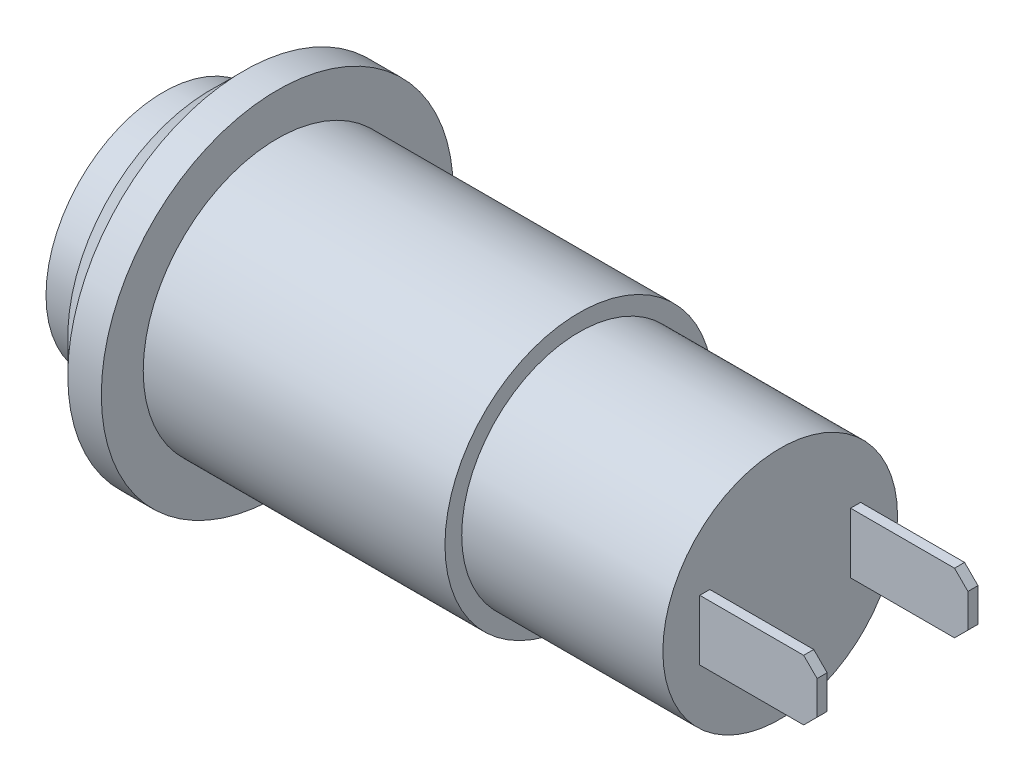
ISO-10303-21;
HEADER;
FILE_DESCRIPTION(('STEP AP214'),'2;1');
FILE_NAME('part.step','',(''),(''),'','','');
FILE_SCHEMA(('AUTOMOTIVE_DESIGN { 1 0 10303 214 1 1 1 1 }'));
ENDSEC;
DATA;
#1=APPLICATION_CONTEXT('core data for automotive mechanical design processes');
#2=APPLICATION_PROTOCOL_DEFINITION('international standard','automotive_design',2000,#1);
#3=PRODUCT_CONTEXT('',#1,'mechanical');
#4=PRODUCT('Part','Part','',(#3));
#5=PRODUCT_RELATED_PRODUCT_CATEGORY('part','',(#4));
#6=PRODUCT_DEFINITION_FORMATION('','',#4);
#7=PRODUCT_DEFINITION_CONTEXT('part definition',#1,'design');
#8=PRODUCT_DEFINITION('design','',#6,#7);
#9=PRODUCT_DEFINITION_SHAPE('','',#8);
#10=(LENGTH_UNIT() NAMED_UNIT(*) SI_UNIT(.MILLI.,.METRE.));
#11=(NAMED_UNIT(*) PLANE_ANGLE_UNIT() SI_UNIT($,.RADIAN.));
#12=(NAMED_UNIT(*) SI_UNIT($,.STERADIAN.) SOLID_ANGLE_UNIT());
#13=UNCERTAINTY_MEASURE_WITH_UNIT(LENGTH_MEASURE(1.E-05),#10,'distance_accuracy_value','');
#14=(GEOMETRIC_REPRESENTATION_CONTEXT(3) GLOBAL_UNCERTAINTY_ASSIGNED_CONTEXT((#13)) GLOBAL_UNIT_ASSIGNED_CONTEXT((#10,
#11,#12)) REPRESENTATION_CONTEXT('',''));
#15=CARTESIAN_POINT('',(0.,0.,0.));
#16=DIRECTION('',(0.,0.,1.));
#17=DIRECTION('',(1.,0.,0.));
#18=AXIS2_PLACEMENT_3D('',#15,#16,#17);
#19=CARTESIAN_POINT('',(18.4,0.,0.));
#20=DIRECTION('',(-1.,0.,0.));
#21=DIRECTION('',(0.,0.,1.));
#22=AXIS2_PLACEMENT_3D('',#19,#20,#21);
#23=PLANE('',#22);
#24=DIRECTION('',(0.,-1.,0.));
#25=VECTOR('',#24,1.);
#26=CARTESIAN_POINT('',(18.4,-0.9,2.4));
#27=LINE('',#26,#25);
#28=CARTESIAN_POINT('',(18.4,0.9,2.4));
#29=VERTEX_POINT('',#28);
#30=CARTESIAN_POINT('',(18.4,-0.9,2.4));
#31=VERTEX_POINT('',#30);
#32=EDGE_CURVE('E177',#29,#31,#27,.T.);
#33=ORIENTED_EDGE('',*,*,#32,.F.);
#34=DIRECTION('',(0.,0.,1.));
#35=VECTOR('',#34,1.);
#36=CARTESIAN_POINT('',(18.4,0.9,2.1));
#37=LINE('',#36,#35);
#38=CARTESIAN_POINT('',(18.4,0.9,2.1));
#39=VERTEX_POINT('',#38);
#40=EDGE_CURVE('E183',#39,#29,#37,.T.);
#41=ORIENTED_EDGE('',*,*,#40,.F.);
#42=DIRECTION('',(0.,1.,0.));
#43=VECTOR('',#42,1.);
#44=CARTESIAN_POINT('',(18.4,-0.9,2.1));
#45=LINE('',#44,#43);
#46=CARTESIAN_POINT('',(18.4,-0.9,2.1));
#47=VERTEX_POINT('',#46);
#48=EDGE_CURVE('E195',#47,#39,#45,.T.);
#49=ORIENTED_EDGE('',*,*,#48,.F.);
#50=DIRECTION('',(0.,0.,-1.));
#51=VECTOR('',#50,1.);
#52=CARTESIAN_POINT('',(18.4,-0.9,2.1));
#53=LINE('',#52,#51);
#54=EDGE_CURVE('E191',#31,#47,#53,.T.);
#55=ORIENTED_EDGE('',*,*,#54,.F.);
#56=EDGE_LOOP('',(#33,#41,#49,#55));
#57=FACE_BOUND('',#56,.T.);
#58=CARTESIAN_POINT('',(18.4,0.,0.));
#59=DIRECTION('',(-1.,0.,0.));
#60=DIRECTION('',(0.,0.,1.));
#61=AXIS2_PLACEMENT_3D('',#58,#59,#60);
#62=CIRCLE('',#61,3.5);
#63=CARTESIAN_POINT('',(18.4,0.,3.5));
#64=VERTEX_POINT('',#63);
#65=EDGE_CURVE('E237',#64,#64,#62,.T.);
#66=ORIENTED_EDGE('',*,*,#65,.F.);
#67=EDGE_LOOP('',(#66));
#68=FACE_BOUND('',#67,.T.);
#69=DIRECTION('',(0.,1.,0.));
#70=VECTOR('',#69,1.);
#71=CARTESIAN_POINT('',(18.4,-0.9,-2.4));
#72=LINE('',#71,#70);
#73=CARTESIAN_POINT('',(18.4,-0.9,-2.4));
#74=VERTEX_POINT('',#73);
#75=CARTESIAN_POINT('',(18.4,0.9,-2.4));
#76=VERTEX_POINT('',#75);
#77=EDGE_CURVE('E140',#74,#76,#72,.T.);
#78=ORIENTED_EDGE('',*,*,#77,.F.);
#79=DIRECTION('',(0.,0.,-1.));
#80=VECTOR('',#79,1.);
#81=CARTESIAN_POINT('',(18.4,-0.9,-2.1));
#82=LINE('',#81,#80);
#83=CARTESIAN_POINT('',(18.4,-0.9,-2.1));
#84=VERTEX_POINT('',#83);
#85=EDGE_CURVE('E151',#84,#74,#82,.T.);
#86=ORIENTED_EDGE('',*,*,#85,.F.);
#87=DIRECTION('',(0.,-1.,0.));
#88=VECTOR('',#87,1.);
#89=CARTESIAN_POINT('',(18.4,-0.9,-2.1));
#90=LINE('',#89,#88);
#91=CARTESIAN_POINT('',(18.4,0.9,-2.1));
#92=VERTEX_POINT('',#91);
#93=EDGE_CURVE('E160',#92,#84,#90,.T.);
#94=ORIENTED_EDGE('',*,*,#93,.F.);
#95=DIRECTION('',(0.,0.,1.));
#96=VECTOR('',#95,1.);
#97=CARTESIAN_POINT('',(18.4,0.9,-2.1));
#98=LINE('',#97,#96);
#99=EDGE_CURVE('E154',#76,#92,#98,.T.);
#100=ORIENTED_EDGE('',*,*,#99,.F.);
#101=EDGE_LOOP('',(#78,#86,#94,#100));
#102=FACE_BOUND('',#101,.T.);
#103=ADVANCED_FACE('F45',(#57,#68,#102),#23,.F.);
#104=CARTESIAN_POINT('',(0.,0.,0.));
#105=DIRECTION('',(-1.,0.,0.));
#106=DIRECTION('',(0.,0.,1.));
#107=AXIS2_PLACEMENT_3D('',#104,#105,#106);
#108=CYLINDRICAL_SURFACE('',#107,3.5);
#109=CARTESIAN_POINT('',(12.4,0.,0.));
#110=DIRECTION('',(-1.,0.,0.));
#111=DIRECTION('',(0.,0.,1.));
#112=AXIS2_PLACEMENT_3D('',#109,#110,#111);
#113=CIRCLE('',#112,3.5);
#114=CARTESIAN_POINT('',(12.4,0.,3.5));
#115=VERTEX_POINT('',#114);
#116=EDGE_CURVE('E233',#115,#115,#113,.T.);
#117=ORIENTED_EDGE('',*,*,#116,.F.);
#118=EDGE_LOOP('',(#117));
#119=FACE_BOUND('',#118,.T.);
#120=ORIENTED_EDGE('',*,*,#65,.T.);
#121=EDGE_LOOP('',(#120));
#122=FACE_BOUND('',#121,.T.);
#123=ADVANCED_FACE('F325',(#119,#122),#108,.T.);
#124=CARTESIAN_POINT('',(12.4,3.5,0.));
#125=DIRECTION('',(-1.,0.,0.));
#126=DIRECTION('',(0.,0.,1.));
#127=AXIS2_PLACEMENT_3D('',#124,#125,#126);
#128=PLANE('',#127);
#129=CARTESIAN_POINT('',(12.4,0.,0.));
#130=DIRECTION('',(-1.,0.,0.));
#131=DIRECTION('',(0.,0.,1.));
#132=AXIS2_PLACEMENT_3D('',#129,#130,#131);
#133=CIRCLE('',#132,4.);
#134=CARTESIAN_POINT('',(12.4,0.,4.));
#135=VERTEX_POINT('',#134);
#136=EDGE_CURVE('E229',#135,#135,#133,.T.);
#137=ORIENTED_EDGE('',*,*,#136,.F.);
#138=EDGE_LOOP('',(#137));
#139=FACE_BOUND('',#138,.T.);
#140=ORIENTED_EDGE('',*,*,#116,.T.);
#141=EDGE_LOOP('',(#140));
#142=FACE_BOUND('',#141,.T.);
#143=ADVANCED_FACE('F330',(#139,#142),#128,.F.);
#144=CARTESIAN_POINT('',(0.,0.,0.));
#145=DIRECTION('',(-1.,0.,0.));
#146=DIRECTION('',(0.,0.,1.));
#147=AXIS2_PLACEMENT_3D('',#144,#145,#146);
#148=CYLINDRICAL_SURFACE('',#147,4.);
#149=CARTESIAN_POINT('',(3.4,0.,0.));
#150=DIRECTION('',(-1.,0.,0.));
#151=DIRECTION('',(0.,0.,1.));
#152=AXIS2_PLACEMENT_3D('',#149,#150,#151);
#153=CIRCLE('',#152,4.);
#154=CARTESIAN_POINT('',(3.4,0.,4.));
#155=VERTEX_POINT('',#154);
#156=EDGE_CURVE('E225',#155,#155,#153,.T.);
#157=ORIENTED_EDGE('',*,*,#156,.F.);
#158=EDGE_LOOP('',(#157));
#159=FACE_BOUND('',#158,.T.);
#160=ORIENTED_EDGE('',*,*,#136,.T.);
#161=EDGE_LOOP('',(#160));
#162=FACE_BOUND('',#161,.T.);
#163=ADVANCED_FACE('F336',(#159,#162),#148,.T.);
#164=CARTESIAN_POINT('',(3.4,4.,0.));
#165=DIRECTION('',(-1.,0.,0.));
#166=DIRECTION('',(0.,0.,1.));
#167=AXIS2_PLACEMENT_3D('',#164,#165,#166);
#168=PLANE('',#167);
#169=CARTESIAN_POINT('',(3.4,0.,0.));
#170=DIRECTION('',(-1.,0.,0.));
#171=DIRECTION('',(0.,0.,1.));
#172=AXIS2_PLACEMENT_3D('',#169,#170,#171);
#173=CIRCLE('',#172,5.25);
#174=CARTESIAN_POINT('',(3.4,0.,5.25));
#175=VERTEX_POINT('',#174);
#176=EDGE_CURVE('E221',#175,#175,#173,.T.);
#177=ORIENTED_EDGE('',*,*,#176,.F.);
#178=EDGE_LOOP('',(#177));
#179=FACE_BOUND('',#178,.T.);
#180=ORIENTED_EDGE('',*,*,#156,.T.);
#181=EDGE_LOOP('',(#180));
#182=FACE_BOUND('',#181,.T.);
#183=ADVANCED_FACE('F419',(#179,#182),#168,.F.);
#184=CARTESIAN_POINT('',(0.,0.,0.));
#185=DIRECTION('',(-1.,0.,0.));
#186=DIRECTION('',(0.,0.,1.));
#187=AXIS2_PLACEMENT_3D('',#184,#185,#186);
#188=CYLINDRICAL_SURFACE('',#187,5.25);
#189=CARTESIAN_POINT('',(2.4,0.,0.));
#190=DIRECTION('',(1.,0.,0.));
#191=DIRECTION('',(0.,0.,-1.));
#192=AXIS2_PLACEMENT_3D('',#189,#190,#191);
#193=CIRCLE('',#192,5.25);
#194=CARTESIAN_POINT('',(2.4,0.,-5.25));
#195=VERTEX_POINT('',#194);
#196=EDGE_CURVE('E245',#195,#195,#193,.T.);
#197=ORIENTED_EDGE('',*,*,#196,.T.);
#198=EDGE_LOOP('',(#197));
#199=FACE_BOUND('',#198,.T.);
#200=ORIENTED_EDGE('',*,*,#176,.T.);
#201=EDGE_LOOP('',(#200));
#202=FACE_BOUND('',#201,.T.);
#203=ADVANCED_FACE('F415',(#199,#202),#188,.T.);
#204=CARTESIAN_POINT('',(1.4,5.25,0.));
#205=DIRECTION('',(1.,0.,0.));
#206=DIRECTION('',(0.,0.,-1.));
#207=AXIS2_PLACEMENT_3D('',#204,#205,#206);
#208=PLANE('',#207);
#209=CARTESIAN_POINT('',(1.4,0.,0.));
#210=DIRECTION('',(1.,0.,0.));
#211=DIRECTION('',(0.,0.,-1.));
#212=AXIS2_PLACEMENT_3D('',#209,#210,#211);
#213=CIRCLE('',#212,4.25);
#214=CARTESIAN_POINT('',(1.4,0.,-4.25));
#215=VERTEX_POINT('',#214);
#216=EDGE_CURVE('E241',#215,#215,#213,.F.);
#217=ORIENTED_EDGE('',*,*,#216,.T.);
#218=EDGE_LOOP('',(#217));
#219=FACE_BOUND('',#218,.T.);
#220=CARTESIAN_POINT('',(1.4,0.,0.));
#221=DIRECTION('',(-1.,0.,0.));
#222=DIRECTION('',(0.,0.,1.));
#223=AXIS2_PLACEMENT_3D('',#220,#221,#222);
#224=CIRCLE('',#223,3.5);
#225=CARTESIAN_POINT('',(1.4,0.,3.5));
#226=VERTEX_POINT('',#225);
#227=EDGE_CURVE('E217',#226,#226,#224,.T.);
#228=ORIENTED_EDGE('',*,*,#227,.F.);
#229=EDGE_LOOP('',(#228));
#230=FACE_BOUND('',#229,.T.);
#231=ADVANCED_FACE('F411',(#219,#230),#208,.F.);
#232=CARTESIAN_POINT('',(0.,0.,0.));
#233=DIRECTION('',(-1.,0.,0.));
#234=DIRECTION('',(0.,0.,1.));
#235=AXIS2_PLACEMENT_3D('',#232,#233,#234);
#236=CYLINDRICAL_SURFACE('',#235,3.5);
#237=CARTESIAN_POINT('',(0.,0.,0.));
#238=DIRECTION('',(-1.,0.,0.));
#239=DIRECTION('',(0.,0.,1.));
#240=AXIS2_PLACEMENT_3D('',#237,#238,#239);
#241=CIRCLE('',#240,3.5);
#242=CARTESIAN_POINT('',(0.,0.,3.5));
#243=VERTEX_POINT('',#242);
#244=EDGE_CURVE('E213',#243,#243,#241,.T.);
#245=ORIENTED_EDGE('',*,*,#244,.F.);
#246=EDGE_LOOP('',(#245));
#247=FACE_BOUND('',#246,.T.);
#248=ORIENTED_EDGE('',*,*,#227,.T.);
#249=EDGE_LOOP('',(#248));
#250=FACE_BOUND('',#249,.T.);
#251=ADVANCED_FACE('F407',(#247,#250),#236,.T.);
#252=CARTESIAN_POINT('',(0.,3.5,0.));
#253=DIRECTION('',(1.,0.,0.));
#254=DIRECTION('',(0.,0.,-1.));
#255=AXIS2_PLACEMENT_3D('',#252,#253,#254);
#256=PLANE('',#255);
#257=ORIENTED_EDGE('',*,*,#244,.T.);
#258=EDGE_LOOP('',(#257));
#259=FACE_BOUND('',#258,.T.);
#260=ADVANCED_FACE('F349',(#259),#256,.F.);
#261=CARTESIAN_POINT('',(1.4,0.,0.));
#262=DIRECTION('',(1.,0.,0.));
#263=DIRECTION('',(0.,0.,-1.));
#264=AXIS2_PLACEMENT_3D('',#261,#262,#263);
#265=CONICAL_SURFACE('',#264,4.25,0.785398163397446);
#266=ORIENTED_EDGE('',*,*,#196,.F.);
#267=EDGE_LOOP('',(#266));
#268=FACE_BOUND('',#267,.T.);
#269=ORIENTED_EDGE('',*,*,#216,.F.);
#270=EDGE_LOOP('',(#269));
#271=FACE_BOUND('',#270,.T.);
#272=ADVANCED_FACE('F343',(#268,#271),#265,.T.);
#273=CARTESIAN_POINT('',(21.9,-0.9,2.4));
#274=DIRECTION('',(0.,0.,-1.));
#275=DIRECTION('',(0.,1.,0.));
#276=AXIS2_PLACEMENT_3D('',#273,#274,#275);
#277=PLANE('',#276);
#278=DIRECTION('',(-1.,0.,0.));
#279=VECTOR('',#278,1.);
#280=CARTESIAN_POINT('',(21.9,-0.9,2.4));
#281=LINE('',#280,#279);
#282=CARTESIAN_POINT('',(21.5,-0.9,2.4));
#283=VERTEX_POINT('',#282);
#284=EDGE_CURVE('E210',#283,#31,#281,.T.);
#285=ORIENTED_EDGE('',*,*,#284,.F.);
#286=DIRECTION('',(0.707106781186548,0.707106781186547,0.));
#287=VECTOR('',#286,1.);
#288=CARTESIAN_POINT('',(21.9,-0.499999999999999,2.4));
#289=LINE('',#288,#287);
#290=CARTESIAN_POINT('',(21.9,-0.499999999999999,2.4));
#291=VERTEX_POINT('',#290);
#292=EDGE_CURVE('E269',#283,#291,#289,.T.);
#293=ORIENTED_EDGE('',*,*,#292,.T.);
#294=DIRECTION('',(0.,-1.,0.));
#295=VECTOR('',#294,1.);
#296=CARTESIAN_POINT('',(21.9,-0.9,2.4));
#297=LINE('',#296,#295);
#298=CARTESIAN_POINT('',(21.9,0.499999999999999,2.4));
#299=VERTEX_POINT('',#298);
#300=EDGE_CURVE('E178',#299,#291,#297,.T.);
#301=ORIENTED_EDGE('',*,*,#300,.F.);
#302=DIRECTION('',(-0.707106781186548,0.707106781186547,0.));
#303=VECTOR('',#302,1.);
#304=CARTESIAN_POINT('',(21.9,0.499999999999999,2.4));
#305=LINE('',#304,#303);
#306=CARTESIAN_POINT('',(21.5,0.9,2.4));
#307=VERTEX_POINT('',#306);
#308=EDGE_CURVE('E266',#299,#307,#305,.T.);
#309=ORIENTED_EDGE('',*,*,#308,.T.);
#310=DIRECTION('',(-1.,0.,0.));
#311=VECTOR('',#310,1.);
#312=CARTESIAN_POINT('',(21.9,0.9,2.4));
#313=LINE('',#312,#311);
#314=EDGE_CURVE('E187',#307,#29,#313,.T.);
#315=ORIENTED_EDGE('',*,*,#314,.T.);
#316=ORIENTED_EDGE('',*,*,#32,.T.);
#317=EDGE_LOOP('',(#285,#293,#301,#309,#315,#316));
#318=FACE_BOUND('',#317,.T.);
#319=ADVANCED_FACE('F312',(#318),#277,.F.);
#320=CARTESIAN_POINT('',(21.9,-0.9,2.1));
#321=DIRECTION('',(0.,1.,0.));
#322=DIRECTION('',(0.,0.,1.));
#323=AXIS2_PLACEMENT_3D('',#320,#321,#322);
#324=PLANE('',#323);
#325=DIRECTION('',(-1.,0.,0.));
#326=VECTOR('',#325,1.);
#327=CARTESIAN_POINT('',(21.9,-0.9,2.1));
#328=LINE('',#327,#326);
#329=CARTESIAN_POINT('',(21.5,-0.9,2.1));
#330=VERTEX_POINT('',#329);
#331=EDGE_CURVE('E207',#330,#47,#328,.T.);
#332=ORIENTED_EDGE('',*,*,#331,.F.);
#333=DIRECTION('',(0.,0.,1.));
#334=VECTOR('',#333,1.);
#335=CARTESIAN_POINT('',(21.5,-0.9,2.4));
#336=LINE('',#335,#334);
#337=EDGE_CURVE('E263',#330,#283,#336,.T.);
#338=ORIENTED_EDGE('',*,*,#337,.T.);
#339=ORIENTED_EDGE('',*,*,#284,.T.);
#340=ORIENTED_EDGE('',*,*,#54,.T.);
#341=EDGE_LOOP('',(#332,#338,#339,#340));
#342=FACE_BOUND('',#341,.T.);
#343=ADVANCED_FACE('F319',(#342),#324,.F.);
#344=CARTESIAN_POINT('',(21.9,-0.9,2.1));
#345=DIRECTION('',(0.,0.,1.));
#346=DIRECTION('',(0.,-1.,0.));
#347=AXIS2_PLACEMENT_3D('',#344,#345,#346);
#348=PLANE('',#347);
#349=DIRECTION('',(0.,1.,0.));
#350=VECTOR('',#349,1.);
#351=CARTESIAN_POINT('',(21.9,-0.9,2.1));
#352=LINE('',#351,#350);
#353=CARTESIAN_POINT('',(21.9,-0.499999999999999,2.1));
#354=VERTEX_POINT('',#353);
#355=CARTESIAN_POINT('',(21.9,0.499999999999999,2.1));
#356=VERTEX_POINT('',#355);
#357=EDGE_CURVE('E182',#354,#356,#352,.T.);
#358=ORIENTED_EDGE('',*,*,#357,.F.);
#359=DIRECTION('',(-0.707106781186548,-0.707106781186547,0.));
#360=VECTOR('',#359,1.);
#361=CARTESIAN_POINT('',(21.9,-0.499999999999999,2.1));
#362=LINE('',#361,#360);
#363=EDGE_CURVE('E260',#354,#330,#362,.T.);
#364=ORIENTED_EDGE('',*,*,#363,.T.);
#365=ORIENTED_EDGE('',*,*,#331,.T.);
#366=ORIENTED_EDGE('',*,*,#48,.T.);
#367=DIRECTION('',(-1.,0.,0.));
#368=VECTOR('',#367,1.);
#369=CARTESIAN_POINT('',(21.9,0.9,2.1));
#370=LINE('',#369,#368);
#371=CARTESIAN_POINT('',(21.5,0.9,2.1));
#372=VERTEX_POINT('',#371);
#373=EDGE_CURVE('E204',#372,#39,#370,.T.);
#374=ORIENTED_EDGE('',*,*,#373,.F.);
#375=DIRECTION('',(0.707106781186548,-0.707106781186547,0.));
#376=VECTOR('',#375,1.);
#377=CARTESIAN_POINT('',(21.9,0.499999999999999,2.1));
#378=LINE('',#377,#376);
#379=EDGE_CURVE('E257',#372,#356,#378,.T.);
#380=ORIENTED_EDGE('',*,*,#379,.T.);
#381=EDGE_LOOP('',(#358,#364,#365,#366,#374,#380));
#382=FACE_BOUND('',#381,.T.);
#383=ADVANCED_FACE('F302',(#382),#348,.F.);
#384=CARTESIAN_POINT('',(21.9,0.9,2.1));
#385=DIRECTION('',(0.,-1.,0.));
#386=DIRECTION('',(0.,0.,-1.));
#387=AXIS2_PLACEMENT_3D('',#384,#385,#386);
#388=PLANE('',#387);
#389=ORIENTED_EDGE('',*,*,#314,.F.);
#390=DIRECTION('',(0.,0.,-1.));
#391=VECTOR('',#390,1.);
#392=CARTESIAN_POINT('',(21.5,0.9,2.1));
#393=LINE('',#392,#391);
#394=EDGE_CURVE('E55',#307,#372,#393,.T.);
#395=ORIENTED_EDGE('',*,*,#394,.T.);
#396=ORIENTED_EDGE('',*,*,#373,.T.);
#397=ORIENTED_EDGE('',*,*,#40,.T.);
#398=EDGE_LOOP('',(#389,#395,#396,#397));
#399=FACE_BOUND('',#398,.T.);
#400=ADVANCED_FACE('F296',(#399),#388,.F.);
#401=CARTESIAN_POINT('',(21.9,0.,0.));
#402=DIRECTION('',(1.,0.,0.));
#403=DIRECTION('',(0.,0.,-1.));
#404=AXIS2_PLACEMENT_3D('',#401,#402,#403);
#405=PLANE('',#404);
#406=ORIENTED_EDGE('',*,*,#300,.T.);
#407=DIRECTION('',(0.,0.,-1.));
#408=VECTOR('',#407,1.);
#409=CARTESIAN_POINT('',(21.9,-0.499999999999999,2.1));
#410=LINE('',#409,#408);
#411=EDGE_CURVE('E253',#291,#354,#410,.T.);
#412=ORIENTED_EDGE('',*,*,#411,.T.);
#413=ORIENTED_EDGE('',*,*,#357,.T.);
#414=DIRECTION('',(0.,0.,1.));
#415=VECTOR('',#414,1.);
#416=CARTESIAN_POINT('',(21.9,0.499999999999999,2.4));
#417=LINE('',#416,#415);
#418=EDGE_CURVE('E249',#356,#299,#417,.T.);
#419=ORIENTED_EDGE('',*,*,#418,.T.);
#420=EDGE_LOOP('',(#406,#412,#413,#419));
#421=FACE_BOUND('',#420,.T.);
#422=ADVANCED_FACE('F308',(#421),#405,.T.);
#423=CARTESIAN_POINT('',(21.9,-0.9,-2.4));
#424=DIRECTION('',(0.,0.,1.));
#425=DIRECTION('',(0.,-1.,0.));
#426=AXIS2_PLACEMENT_3D('',#423,#424,#425);
#427=PLANE('',#426);
#428=DIRECTION('',(0.,1.,0.));
#429=VECTOR('',#428,1.);
#430=CARTESIAN_POINT('',(21.9,-0.9,-2.4));
#431=LINE('',#430,#429);
#432=CARTESIAN_POINT('',(21.9,-0.499999999999999,-2.4));
#433=VERTEX_POINT('',#432);
#434=CARTESIAN_POINT('',(21.9,0.499999999999999,-2.4));
#435=VERTEX_POINT('',#434);
#436=EDGE_CURVE('E159',#433,#435,#431,.T.);
#437=ORIENTED_EDGE('',*,*,#436,.F.);
#438=DIRECTION('',(0.707106781186547,0.707106781186548,0.));
#439=VECTOR('',#438,1.);
#440=CARTESIAN_POINT('',(21.9,-0.499999999999999,-2.4));
#441=LINE('',#440,#439);
#442=CARTESIAN_POINT('',(21.5,-0.9,-2.4));
#443=VERTEX_POINT('',#442);
#444=EDGE_CURVE('E141',#433,#443,#441,.F.);
#445=ORIENTED_EDGE('',*,*,#444,.T.);
#446=DIRECTION('',(-1.,0.,0.));
#447=VECTOR('',#446,1.);
#448=CARTESIAN_POINT('',(21.9,-0.9,-2.4));
#449=LINE('',#448,#447);
#450=EDGE_CURVE('E135',#443,#74,#449,.T.);
#451=ORIENTED_EDGE('',*,*,#450,.T.);
#452=ORIENTED_EDGE('',*,*,#77,.T.);
#453=DIRECTION('',(-1.,0.,0.));
#454=VECTOR('',#453,1.);
#455=CARTESIAN_POINT('',(21.9,0.9,-2.4));
#456=LINE('',#455,#454);
#457=CARTESIAN_POINT('',(21.5,0.9,-2.4));
#458=VERTEX_POINT('',#457);
#459=EDGE_CURVE('E174',#458,#76,#456,.T.);
#460=ORIENTED_EDGE('',*,*,#459,.F.);
#461=DIRECTION('',(-0.707106781186548,0.707106781186547,0.));
#462=VECTOR('',#461,1.);
#463=CARTESIAN_POINT('',(21.9,0.499999999999998,-2.4));
#464=LINE('',#463,#462);
#465=EDGE_CURVE('E280',#458,#435,#464,.F.);
#466=ORIENTED_EDGE('',*,*,#465,.T.);
#467=EDGE_LOOP('',(#437,#445,#451,#452,#460,#466));
#468=FACE_BOUND('',#467,.T.);
#469=ADVANCED_FACE('F138',(#468),#427,.F.);
#470=CARTESIAN_POINT('',(21.9,0.9,-2.1));
#471=DIRECTION('',(0.,-1.,0.));
#472=DIRECTION('',(0.,0.,-1.));
#473=AXIS2_PLACEMENT_3D('',#470,#471,#472);
#474=PLANE('',#473);
#475=DIRECTION('',(-1.,0.,0.));
#476=VECTOR('',#475,1.);
#477=CARTESIAN_POINT('',(21.9,0.9,-2.1));
#478=LINE('',#477,#476);
#479=CARTESIAN_POINT('',(21.5,0.9,-2.1));
#480=VERTEX_POINT('',#479);
#481=EDGE_CURVE('E171',#480,#92,#478,.T.);
#482=ORIENTED_EDGE('',*,*,#481,.F.);
#483=DIRECTION('',(0.,0.,-1.));
#484=VECTOR('',#483,1.);
#485=CARTESIAN_POINT('',(21.5,0.9,-2.1));
#486=LINE('',#485,#484);
#487=EDGE_CURVE('E11',#480,#458,#486,.T.);
#488=ORIENTED_EDGE('',*,*,#487,.T.);
#489=ORIENTED_EDGE('',*,*,#459,.T.);
#490=ORIENTED_EDGE('',*,*,#99,.T.);
#491=EDGE_LOOP('',(#482,#488,#489,#490));
#492=FACE_BOUND('',#491,.T.);
#493=ADVANCED_FACE('F381',(#492),#474,.F.);
#494=CARTESIAN_POINT('',(21.9,-0.9,-2.1));
#495=DIRECTION('',(0.,0.,-1.));
#496=DIRECTION('',(0.,1.,0.));
#497=AXIS2_PLACEMENT_3D('',#494,#495,#496);
#498=PLANE('',#497);
#499=DIRECTION('',(-1.,0.,0.));
#500=VECTOR('',#499,1.);
#501=CARTESIAN_POINT('',(21.9,-0.9,-2.1));
#502=LINE('',#501,#500);
#503=CARTESIAN_POINT('',(21.5,-0.9,-2.1));
#504=VERTEX_POINT('',#503);
#505=EDGE_CURVE('E144',#504,#84,#502,.T.);
#506=ORIENTED_EDGE('',*,*,#505,.F.);
#507=DIRECTION('',(-0.707106781186547,-0.707106781186548,0.));
#508=VECTOR('',#507,1.);
#509=CARTESIAN_POINT('',(21.9,-0.499999999999999,-2.1));
#510=LINE('',#509,#508);
#511=CARTESIAN_POINT('',(21.9,-0.499999999999999,-2.1));
#512=VERTEX_POINT('',#511);
#513=EDGE_CURVE('E289',#504,#512,#510,.F.);
#514=ORIENTED_EDGE('',*,*,#513,.T.);
#515=DIRECTION('',(0.,-1.,0.));
#516=VECTOR('',#515,1.);
#517=CARTESIAN_POINT('',(21.9,-0.9,-2.1));
#518=LINE('',#517,#516);
#519=CARTESIAN_POINT('',(21.9,0.499999999999999,-2.1));
#520=VERTEX_POINT('',#519);
#521=EDGE_CURVE('E145',#520,#512,#518,.T.);
#522=ORIENTED_EDGE('',*,*,#521,.F.);
#523=DIRECTION('',(0.707106781186548,-0.707106781186547,0.));
#524=VECTOR('',#523,1.);
#525=CARTESIAN_POINT('',(21.9,0.499999999999999,-2.1));
#526=LINE('',#525,#524);
#527=EDGE_CURVE('E62',#520,#480,#526,.F.);
#528=ORIENTED_EDGE('',*,*,#527,.T.);
#529=ORIENTED_EDGE('',*,*,#481,.T.);
#530=ORIENTED_EDGE('',*,*,#93,.T.);
#531=EDGE_LOOP('',(#506,#514,#522,#528,#529,#530));
#532=FACE_BOUND('',#531,.T.);
#533=ADVANCED_FACE('F379',(#532),#498,.F.);
#534=CARTESIAN_POINT('',(21.9,-0.9,-2.1));
#535=DIRECTION('',(0.,1.,0.));
#536=DIRECTION('',(0.,0.,1.));
#537=AXIS2_PLACEMENT_3D('',#534,#535,#536);
#538=PLANE('',#537);
#539=ORIENTED_EDGE('',*,*,#450,.F.);
#540=DIRECTION('',(0.,0.,1.));
#541=VECTOR('',#540,1.);
#542=CARTESIAN_POINT('',(21.5,-0.9,-2.1));
#543=LINE('',#542,#541);
#544=EDGE_CURVE('E70',#443,#504,#543,.T.);
#545=ORIENTED_EDGE('',*,*,#544,.T.);
#546=ORIENTED_EDGE('',*,*,#505,.T.);
#547=ORIENTED_EDGE('',*,*,#85,.T.);
#548=EDGE_LOOP('',(#539,#545,#546,#547));
#549=FACE_BOUND('',#548,.T.);
#550=ADVANCED_FACE('F157',(#549),#538,.F.);
#551=CARTESIAN_POINT('',(21.9,0.,0.));
#552=DIRECTION('',(-1.,0.,0.));
#553=DIRECTION('',(0.,0.,1.));
#554=AXIS2_PLACEMENT_3D('',#551,#552,#553);
#555=PLANE('',#554);
#556=ORIENTED_EDGE('',*,*,#521,.T.);
#557=DIRECTION('',(0.,0.,-1.));
#558=VECTOR('',#557,1.);
#559=CARTESIAN_POINT('',(21.9,-0.499999999999998,0.));
#560=LINE('',#559,#558);
#561=EDGE_CURVE('E276',#512,#433,#560,.T.);
#562=ORIENTED_EDGE('',*,*,#561,.T.);
#563=ORIENTED_EDGE('',*,*,#436,.T.);
#564=DIRECTION('',(0.,0.,1.));
#565=VECTOR('',#564,1.);
#566=CARTESIAN_POINT('',(21.9,0.499999999999998,0.));
#567=LINE('',#566,#565);
#568=EDGE_CURVE('E272',#435,#520,#567,.T.);
#569=ORIENTED_EDGE('',*,*,#568,.T.);
#570=EDGE_LOOP('',(#556,#562,#563,#569));
#571=FACE_BOUND('',#570,.T.);
#572=ADVANCED_FACE('F357',(#571),#555,.F.);
#573=CARTESIAN_POINT('',(21.9,-0.499999999999998,0.));
#574=DIRECTION('',(0.707106781186547,-0.707106781186548,0.));
#575=DIRECTION('',(0.,0.,1.));
#576=AXIS2_PLACEMENT_3D('',#573,#574,#575);
#577=PLANE('',#576);
#578=ORIENTED_EDGE('',*,*,#292,.F.);
#579=ORIENTED_EDGE('',*,*,#337,.F.);
#580=ORIENTED_EDGE('',*,*,#363,.F.);
#581=ORIENTED_EDGE('',*,*,#411,.F.);
#582=EDGE_LOOP('',(#578,#579,#580,#581));
#583=FACE_BOUND('',#582,.T.);
#584=ADVANCED_FACE('F316',(#583),#577,.T.);
#585=CARTESIAN_POINT('',(21.9,-0.499999999999998,0.));
#586=DIRECTION('',(-0.707106781186548,0.707106781186547,0.));
#587=DIRECTION('',(0.,0.,-1.));
#588=AXIS2_PLACEMENT_3D('',#585,#586,#587);
#589=PLANE('',#588);
#590=ORIENTED_EDGE('',*,*,#513,.F.);
#591=ORIENTED_EDGE('',*,*,#544,.F.);
#592=ORIENTED_EDGE('',*,*,#444,.F.);
#593=ORIENTED_EDGE('',*,*,#561,.F.);
#594=EDGE_LOOP('',(#590,#591,#592,#593));
#595=FACE_BOUND('',#594,.T.);
#596=ADVANCED_FACE('F356',(#595),#589,.F.);
#597=CARTESIAN_POINT('',(21.9,0.499999999999998,0.));
#598=DIRECTION('',(0.707106781186547,0.707106781186548,0.));
#599=DIRECTION('',(0.,0.,-1.));
#600=AXIS2_PLACEMENT_3D('',#597,#598,#599);
#601=PLANE('',#600);
#602=ORIENTED_EDGE('',*,*,#379,.F.);
#603=ORIENTED_EDGE('',*,*,#394,.F.);
#604=ORIENTED_EDGE('',*,*,#308,.F.);
#605=ORIENTED_EDGE('',*,*,#418,.F.);
#606=EDGE_LOOP('',(#602,#603,#604,#605));
#607=FACE_BOUND('',#606,.T.);
#608=ADVANCED_FACE('F305',(#607),#601,.T.);
#609=CARTESIAN_POINT('',(21.9,0.499999999999998,0.));
#610=DIRECTION('',(-0.707106781186547,-0.707106781186548,0.));
#611=DIRECTION('',(0.,0.,1.));
#612=AXIS2_PLACEMENT_3D('',#609,#610,#611);
#613=PLANE('',#612);
#614=ORIENTED_EDGE('',*,*,#465,.F.);
#615=ORIENTED_EDGE('',*,*,#487,.F.);
#616=ORIENTED_EDGE('',*,*,#527,.F.);
#617=ORIENTED_EDGE('',*,*,#568,.F.);
#618=EDGE_LOOP('',(#614,#615,#616,#617));
#619=FACE_BOUND('',#618,.T.);
#620=ADVANCED_FACE('F48',(#619),#613,.F.);
#621=CLOSED_SHELL('',(#103,#123,#143,#163,#183,#203,#231,#251,#260,#272,#319,#343,#383,#400,
#422,#469,#493,#533,#550,#572,#584,#596,#608,#620));
#622=MANIFOLD_SOLID_BREP('B2',#621);
#623=ADVANCED_BREP_SHAPE_REPRESENTATION('',(#18,#622),#14);
#624=SHAPE_DEFINITION_REPRESENTATION(#9,#623);
ENDSEC;
END-ISO-10303-21;
